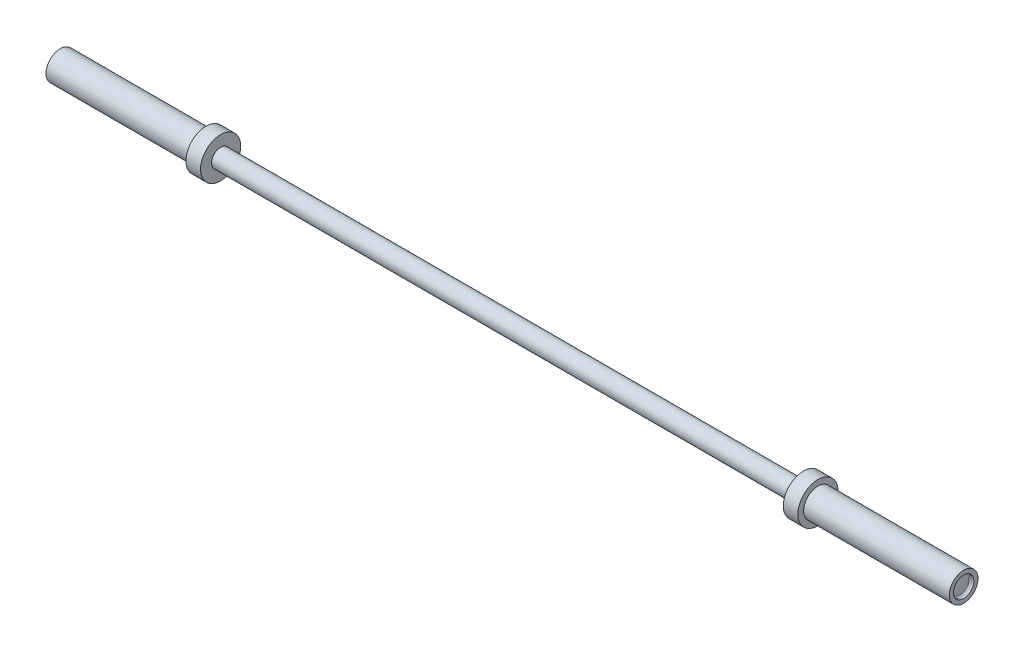
ISO-10303-21;
HEADER;
FILE_DESCRIPTION(('STEP AP214'),'2;1');
FILE_NAME('part.step','',(''),(''),'','','');
FILE_SCHEMA(('AUTOMOTIVE_DESIGN { 1 0 10303 214 1 1 1 1 }'));
ENDSEC;
DATA;
#1=APPLICATION_CONTEXT('core data for automotive mechanical design processes');
#2=APPLICATION_PROTOCOL_DEFINITION('international standard','automotive_design',2000,#1);
#3=PRODUCT_CONTEXT('',#1,'mechanical');
#4=PRODUCT('Part','Part','',(#3));
#5=PRODUCT_RELATED_PRODUCT_CATEGORY('part','',(#4));
#6=PRODUCT_DEFINITION_FORMATION('','',#4);
#7=PRODUCT_DEFINITION_CONTEXT('part definition',#1,'design');
#8=PRODUCT_DEFINITION('design','',#6,#7);
#9=PRODUCT_DEFINITION_SHAPE('','',#8);
#10=(LENGTH_UNIT() NAMED_UNIT(*) SI_UNIT(.MILLI.,.METRE.));
#11=(NAMED_UNIT(*) PLANE_ANGLE_UNIT() SI_UNIT($,.RADIAN.));
#12=(NAMED_UNIT(*) SI_UNIT($,.STERADIAN.) SOLID_ANGLE_UNIT());
#13=UNCERTAINTY_MEASURE_WITH_UNIT(LENGTH_MEASURE(1.E-05),#10,'distance_accuracy_value','');
#14=(GEOMETRIC_REPRESENTATION_CONTEXT(3) GLOBAL_UNCERTAINTY_ASSIGNED_CONTEXT((#13)) GLOBAL_UNIT_ASSIGNED_CONTEXT((#10,
#11,#12)) REPRESENTATION_CONTEXT('',''));
#15=CARTESIAN_POINT('',(0.,0.,0.));
#16=DIRECTION('',(0.,0.,1.));
#17=DIRECTION('',(1.,0.,0.));
#18=AXIS2_PLACEMENT_3D('',#15,#16,#17);
#19=CARTESIAN_POINT('',(1016.,0.,0.));
#20=DIRECTION('',(-1.,0.,0.));
#21=DIRECTION('',(0.,0.,1.));
#22=AXIS2_PLACEMENT_3D('',#19,#20,#21);
#23=CYLINDRICAL_SURFACE('',#22,15.875);
#24=CARTESIAN_POINT('',(1016.,0.,0.));
#25=DIRECTION('',(1.,0.,0.));
#26=DIRECTION('',(0.,0.,-1.));
#27=AXIS2_PLACEMENT_3D('',#24,#25,#26);
#28=CIRCLE('',#27,15.875);
#29=CARTESIAN_POINT('',(1016.,0.,-15.875));
#30=VERTEX_POINT('',#29);
#31=EDGE_CURVE('E58',#30,#30,#28,.T.);
#32=ORIENTED_EDGE('',*,*,#31,.F.);
#33=EDGE_LOOP('',(#32));
#34=FACE_BOUND('',#33,.T.);
#35=CARTESIAN_POINT('',(0.,0.,0.));
#36=DIRECTION('',(1.,0.,0.));
#37=DIRECTION('',(0.,0.,-1.));
#38=AXIS2_PLACEMENT_3D('',#35,#36,#37);
#39=CIRCLE('',#38,15.875);
#40=CARTESIAN_POINT('',(0.,0.,-15.875));
#41=VERTEX_POINT('',#40);
#42=EDGE_CURVE('E53',#41,#41,#39,.T.);
#43=ORIENTED_EDGE('',*,*,#42,.T.);
#44=EDGE_LOOP('',(#43));
#45=FACE_BOUND('',#44,.T.);
#46=ADVANCED_FACE('F32',(#34,#45),#23,.T.);
#47=CARTESIAN_POINT('',(1041.4,0.,0.));
#48=DIRECTION('',(-1.,0.,0.));
#49=DIRECTION('',(0.,0.,1.));
#50=AXIS2_PLACEMENT_3D('',#47,#48,#49);
#51=CYLINDRICAL_SURFACE('',#50,34.999999977);
#52=CARTESIAN_POINT('',(1041.4,0.,0.));
#53=DIRECTION('',(1.,0.,0.));
#54=DIRECTION('',(0.,0.,-1.));
#55=AXIS2_PLACEMENT_3D('',#52,#53,#54);
#56=CIRCLE('',#55,34.999999977);
#57=CARTESIAN_POINT('',(1041.4,0.,-34.999999977));
#58=VERTEX_POINT('',#57);
#59=EDGE_CURVE('E62',#58,#58,#56,.T.);
#60=ORIENTED_EDGE('',*,*,#59,.F.);
#61=EDGE_LOOP('',(#60));
#62=FACE_BOUND('',#61,.T.);
#63=CARTESIAN_POINT('',(1016.,0.,0.));
#64=DIRECTION('',(1.,0.,0.));
#65=DIRECTION('',(0.,0.,-1.));
#66=AXIS2_PLACEMENT_3D('',#63,#64,#65);
#67=CIRCLE('',#66,34.999999977);
#68=CARTESIAN_POINT('',(1016.,0.,-34.999999977));
#69=VERTEX_POINT('',#68);
#70=EDGE_CURVE('E56',#69,#69,#67,.T.);
#71=ORIENTED_EDGE('',*,*,#70,.T.);
#72=EDGE_LOOP('',(#71));
#73=FACE_BOUND('',#72,.T.);
#74=ADVANCED_FACE('F109',(#62,#73),#51,.T.);
#75=CARTESIAN_POINT('',(1041.4,0.,0.));
#76=DIRECTION('',(1.,0.,0.));
#77=DIRECTION('',(0.,0.,-1.));
#78=AXIS2_PLACEMENT_3D('',#75,#76,#77);
#79=PLANE('',#78);
#80=CARTESIAN_POINT('',(1041.4,0.,0.));
#81=DIRECTION('',(1.,0.,0.));
#82=DIRECTION('',(0.,0.,-1.));
#83=AXIS2_PLACEMENT_3D('',#80,#81,#82);
#84=CIRCLE('',#83,25.);
#85=CARTESIAN_POINT('',(1041.4,0.,-25.));
#86=VERTEX_POINT('',#85);
#87=EDGE_CURVE('E61',#86,#86,#84,.T.);
#88=ORIENTED_EDGE('',*,*,#87,.F.);
#89=EDGE_LOOP('',(#88));
#90=FACE_BOUND('',#89,.T.);
#91=ORIENTED_EDGE('',*,*,#59,.T.);
#92=EDGE_LOOP('',(#91));
#93=FACE_BOUND('',#92,.T.);
#94=ADVANCED_FACE('F105',(#90,#93),#79,.T.);
#95=CARTESIAN_POINT('',(1016.,0.,0.));
#96=DIRECTION('',(1.,0.,0.));
#97=DIRECTION('',(0.,0.,-1.));
#98=AXIS2_PLACEMENT_3D('',#95,#96,#97);
#99=PLANE('',#98);
#100=ORIENTED_EDGE('',*,*,#31,.T.);
#101=EDGE_LOOP('',(#100));
#102=FACE_BOUND('',#101,.T.);
#103=ORIENTED_EDGE('',*,*,#70,.F.);
#104=EDGE_LOOP('',(#103));
#105=FACE_BOUND('',#104,.T.);
#106=ADVANCED_FACE('F108',(#102,#105),#99,.F.);
#107=CARTESIAN_POINT('',(-25.4,0.,0.));
#108=DIRECTION('',(1.,0.,0.));
#109=DIRECTION('',(0.,0.,-1.));
#110=AXIS2_PLACEMENT_3D('',#107,#108,#109);
#111=CYLINDRICAL_SURFACE('',#110,34.999999977);
#112=CARTESIAN_POINT('',(-25.4,0.,0.));
#113=DIRECTION('',(-1.,0.,0.));
#114=DIRECTION('',(0.,0.,1.));
#115=AXIS2_PLACEMENT_3D('',#112,#113,#114);
#116=CIRCLE('',#115,34.999999977);
#117=CARTESIAN_POINT('',(-25.4,0.,34.999999977));
#118=VERTEX_POINT('',#117);
#119=EDGE_CURVE('E57',#118,#118,#116,.T.);
#120=ORIENTED_EDGE('',*,*,#119,.F.);
#121=EDGE_LOOP('',(#120));
#122=FACE_BOUND('',#121,.T.);
#123=CARTESIAN_POINT('',(0.,0.,0.));
#124=DIRECTION('',(-1.,0.,0.));
#125=DIRECTION('',(0.,0.,1.));
#126=AXIS2_PLACEMENT_3D('',#123,#124,#125);
#127=CIRCLE('',#126,34.999999977);
#128=CARTESIAN_POINT('',(0.,0.,34.999999977));
#129=VERTEX_POINT('',#128);
#130=EDGE_CURVE('E67',#129,#129,#127,.T.);
#131=ORIENTED_EDGE('',*,*,#130,.T.);
#132=EDGE_LOOP('',(#131));
#133=FACE_BOUND('',#132,.T.);
#134=ADVANCED_FACE('F119',(#122,#133),#111,.T.);
#135=CARTESIAN_POINT('',(-25.4,0.,0.));
#136=DIRECTION('',(-1.,0.,0.));
#137=DIRECTION('',(0.,0.,1.));
#138=AXIS2_PLACEMENT_3D('',#135,#136,#137);
#139=PLANE('',#138);
#140=CARTESIAN_POINT('',(-25.4,0.,0.));
#141=DIRECTION('',(-1.,0.,0.));
#142=DIRECTION('',(0.,0.,1.));
#143=AXIS2_PLACEMENT_3D('',#140,#141,#142);
#144=CIRCLE('',#143,25.);
#145=CARTESIAN_POINT('',(-25.4,0.,25.));
#146=VERTEX_POINT('',#145);
#147=EDGE_CURVE('E52',#146,#146,#144,.T.);
#148=ORIENTED_EDGE('',*,*,#147,.F.);
#149=EDGE_LOOP('',(#148));
#150=FACE_BOUND('',#149,.T.);
#151=ORIENTED_EDGE('',*,*,#119,.T.);
#152=EDGE_LOOP('',(#151));
#153=FACE_BOUND('',#152,.T.);
#154=ADVANCED_FACE('F125',(#150,#153),#139,.T.);
#155=CARTESIAN_POINT('',(0.,0.,0.));
#156=DIRECTION('',(-1.,0.,0.));
#157=DIRECTION('',(0.,0.,1.));
#158=AXIS2_PLACEMENT_3D('',#155,#156,#157);
#159=PLANE('',#158);
#160=ORIENTED_EDGE('',*,*,#42,.F.);
#161=EDGE_LOOP('',(#160));
#162=FACE_BOUND('',#161,.T.);
#163=ORIENTED_EDGE('',*,*,#130,.F.);
#164=EDGE_LOOP('',(#163));
#165=FACE_BOUND('',#164,.T.);
#166=ADVANCED_FACE('F101',(#162,#165),#159,.F.);
#167=CARTESIAN_POINT('',(1295.4,0.,0.));
#168=DIRECTION('',(-1.,0.,0.));
#169=DIRECTION('',(0.,0.,1.));
#170=AXIS2_PLACEMENT_3D('',#167,#168,#169);
#171=CYLINDRICAL_SURFACE('',#170,25.);
#172=CARTESIAN_POINT('',(1295.4,0.,0.));
#173=DIRECTION('',(1.,0.,0.));
#174=DIRECTION('',(0.,0.,-1.));
#175=AXIS2_PLACEMENT_3D('',#172,#173,#174);
#176=CIRCLE('',#175,25.);
#177=CARTESIAN_POINT('',(1295.4,0.,-25.));
#178=VERTEX_POINT('',#177);
#179=EDGE_CURVE('E70',#178,#178,#176,.T.);
#180=ORIENTED_EDGE('',*,*,#179,.F.);
#181=EDGE_LOOP('',(#180));
#182=FACE_BOUND('',#181,.T.);
#183=ORIENTED_EDGE('',*,*,#87,.T.);
#184=EDGE_LOOP('',(#183));
#185=FACE_BOUND('',#184,.T.);
#186=ADVANCED_FACE('F95',(#182,#185),#171,.T.);
#187=CARTESIAN_POINT('',(1295.4,0.,0.));
#188=DIRECTION('',(1.,0.,0.));
#189=DIRECTION('',(0.,0.,-1.));
#190=AXIS2_PLACEMENT_3D('',#187,#188,#189);
#191=PLANE('',#190);
#192=CARTESIAN_POINT('',(1295.4,0.,0.));
#193=DIRECTION('',(1.,0.,0.));
#194=DIRECTION('',(0.,0.,-1.));
#195=AXIS2_PLACEMENT_3D('',#192,#193,#194);
#196=CIRCLE('',#195,17.78);
#197=CARTESIAN_POINT('',(1295.4,0.,-17.78));
#198=VERTEX_POINT('',#197);
#199=EDGE_CURVE('E85',#198,#198,#196,.T.);
#200=ORIENTED_EDGE('',*,*,#199,.F.);
#201=EDGE_LOOP('',(#200));
#202=FACE_BOUND('',#201,.T.);
#203=ORIENTED_EDGE('',*,*,#179,.T.);
#204=EDGE_LOOP('',(#203));
#205=FACE_BOUND('',#204,.T.);
#206=ADVANCED_FACE('F91',(#202,#205),#191,.T.);
#207=CARTESIAN_POINT('',(-279.4,0.,0.));
#208=DIRECTION('',(1.,0.,0.));
#209=DIRECTION('',(0.,0.,-1.));
#210=AXIS2_PLACEMENT_3D('',#207,#208,#209);
#211=CYLINDRICAL_SURFACE('',#210,25.);
#212=CARTESIAN_POINT('',(-279.4,0.,0.));
#213=DIRECTION('',(-1.,0.,0.));
#214=DIRECTION('',(0.,0.,1.));
#215=AXIS2_PLACEMENT_3D('',#212,#213,#214);
#216=CIRCLE('',#215,25.);
#217=CARTESIAN_POINT('',(-279.4,0.,25.));
#218=VERTEX_POINT('',#217);
#219=EDGE_CURVE('E77',#218,#218,#216,.T.);
#220=ORIENTED_EDGE('',*,*,#219,.F.);
#221=EDGE_LOOP('',(#220));
#222=FACE_BOUND('',#221,.T.);
#223=ORIENTED_EDGE('',*,*,#147,.T.);
#224=EDGE_LOOP('',(#223));
#225=FACE_BOUND('',#224,.T.);
#226=ADVANCED_FACE('F94',(#222,#225),#211,.T.);
#227=CARTESIAN_POINT('',(-279.4,0.,0.));
#228=DIRECTION('',(-1.,0.,0.));
#229=DIRECTION('',(0.,0.,1.));
#230=AXIS2_PLACEMENT_3D('',#227,#228,#229);
#231=PLANE('',#230);
#232=CARTESIAN_POINT('',(-279.4,0.,0.));
#233=DIRECTION('',(-1.,0.,0.));
#234=DIRECTION('',(0.,0.,1.));
#235=AXIS2_PLACEMENT_3D('',#232,#233,#234);
#236=CIRCLE('',#235,17.78);
#237=CARTESIAN_POINT('',(-279.4,0.,17.78));
#238=VERTEX_POINT('',#237);
#239=EDGE_CURVE('E82',#238,#238,#236,.T.);
#240=ORIENTED_EDGE('',*,*,#239,.F.);
#241=EDGE_LOOP('',(#240));
#242=FACE_BOUND('',#241,.T.);
#243=ORIENTED_EDGE('',*,*,#219,.T.);
#244=EDGE_LOOP('',(#243));
#245=FACE_BOUND('',#244,.T.);
#246=ADVANCED_FACE('F161',(#242,#245),#231,.T.);
#247=CARTESIAN_POINT('',(-273.05,0.,0.));
#248=DIRECTION('',(-1.,0.,0.));
#249=DIRECTION('',(0.,0.,1.));
#250=AXIS2_PLACEMENT_3D('',#247,#248,#249);
#251=CYLINDRICAL_SURFACE('',#250,17.78);
#252=CARTESIAN_POINT('',(-275.59,0.,0.));
#253=DIRECTION('',(-1.,0.,0.));
#254=DIRECTION('',(0.,0.,1.));
#255=AXIS2_PLACEMENT_3D('',#252,#253,#254);
#256=CIRCLE('',#255,17.78);
#257=CARTESIAN_POINT('',(-275.59,0.,17.78));
#258=VERTEX_POINT('',#257);
#259=EDGE_CURVE('E10',#258,#258,#256,.F.);
#260=ORIENTED_EDGE('',*,*,#259,.T.);
#261=EDGE_LOOP('',(#260));
#262=FACE_BOUND('',#261,.T.);
#263=ORIENTED_EDGE('',*,*,#239,.T.);
#264=EDGE_LOOP('',(#263));
#265=FACE_BOUND('',#264,.T.);
#266=ADVANCED_FACE('F156',(#262,#265),#251,.F.);
#267=CARTESIAN_POINT('',(-273.05,0.,0.));
#268=DIRECTION('',(-1.,0.,0.));
#269=DIRECTION('',(0.,0.,1.));
#270=AXIS2_PLACEMENT_3D('',#267,#268,#269);
#271=PLANE('',#270);
#272=CARTESIAN_POINT('',(-273.05,0.,0.));
#273=DIRECTION('',(-1.,0.,0.));
#274=DIRECTION('',(0.,0.,1.));
#275=AXIS2_PLACEMENT_3D('',#272,#273,#274);
#276=CIRCLE('',#275,15.24);
#277=CARTESIAN_POINT('',(-273.05,0.,15.24));
#278=VERTEX_POINT('',#277);
#279=EDGE_CURVE('E39',#278,#278,#276,.T.);
#280=ORIENTED_EDGE('',*,*,#279,.T.);
#281=EDGE_LOOP('',(#280));
#282=FACE_BOUND('',#281,.T.);
#283=ADVANCED_FACE('F151',(#282),#271,.T.);
#284=CARTESIAN_POINT('',(1289.05,0.,0.));
#285=DIRECTION('',(1.,0.,0.));
#286=DIRECTION('',(0.,0.,-1.));
#287=AXIS2_PLACEMENT_3D('',#284,#285,#286);
#288=CYLINDRICAL_SURFACE('',#287,17.78);
#289=CARTESIAN_POINT('',(1291.59,0.,0.));
#290=DIRECTION('',(1.,0.,0.));
#291=DIRECTION('',(0.,0.,-1.));
#292=AXIS2_PLACEMENT_3D('',#289,#290,#291);
#293=CIRCLE('',#292,17.78);
#294=CARTESIAN_POINT('',(1291.59,0.,-17.78));
#295=VERTEX_POINT('',#294);
#296=EDGE_CURVE('E43',#295,#295,#293,.F.);
#297=ORIENTED_EDGE('',*,*,#296,.T.);
#298=EDGE_LOOP('',(#297));
#299=FACE_BOUND('',#298,.T.);
#300=ORIENTED_EDGE('',*,*,#199,.T.);
#301=EDGE_LOOP('',(#300));
#302=FACE_BOUND('',#301,.T.);
#303=ADVANCED_FACE('F89',(#299,#302),#288,.F.);
#304=CARTESIAN_POINT('',(1289.05,0.,0.));
#305=DIRECTION('',(1.,0.,0.));
#306=DIRECTION('',(0.,0.,-1.));
#307=AXIS2_PLACEMENT_3D('',#304,#305,#306);
#308=PLANE('',#307);
#309=CARTESIAN_POINT('',(1289.05,0.,0.));
#310=DIRECTION('',(1.,0.,0.));
#311=DIRECTION('',(0.,0.,-1.));
#312=AXIS2_PLACEMENT_3D('',#309,#310,#311);
#313=CIRCLE('',#312,15.24);
#314=CARTESIAN_POINT('',(1289.05,0.,-15.24));
#315=VERTEX_POINT('',#314);
#316=EDGE_CURVE('E47',#315,#315,#313,.T.);
#317=ORIENTED_EDGE('',*,*,#316,.T.);
#318=EDGE_LOOP('',(#317));
#319=FACE_BOUND('',#318,.T.);
#320=ADVANCED_FACE('F137',(#319),#308,.T.);
#321=CARTESIAN_POINT('',(1291.59,0.,0.));
#322=DIRECTION('',(1.,0.,0.));
#323=DIRECTION('',(0.,0.,-1.));
#324=AXIS2_PLACEMENT_3D('',#321,#322,#323);
#325=TOROIDAL_SURFACE('',#324,15.24,2.54);
#326=ORIENTED_EDGE('',*,*,#296,.F.);
#327=EDGE_LOOP('',(#326));
#328=FACE_BOUND('',#327,.T.);
#329=ORIENTED_EDGE('',*,*,#316,.F.);
#330=EDGE_LOOP('',(#329));
#331=FACE_BOUND('',#330,.T.);
#332=ADVANCED_FACE('F135',(#328,#331),#325,.F.);
#333=CARTESIAN_POINT('',(-275.59,0.,0.));
#334=DIRECTION('',(-1.,0.,0.));
#335=DIRECTION('',(0.,0.,1.));
#336=AXIS2_PLACEMENT_3D('',#333,#334,#335);
#337=TOROIDAL_SURFACE('',#336,15.24,2.54);
#338=ORIENTED_EDGE('',*,*,#259,.F.);
#339=EDGE_LOOP('',(#338));
#340=FACE_BOUND('',#339,.T.);
#341=ORIENTED_EDGE('',*,*,#279,.F.);
#342=EDGE_LOOP('',(#341));
#343=FACE_BOUND('',#342,.T.);
#344=ADVANCED_FACE('F34',(#340,#343),#337,.F.);
#345=CLOSED_SHELL('',(#46,#74,#94,#106,#134,#154,#166,#186,#206,#226,#246,#266,#283,#303,#320,
#332,#344));
#346=MANIFOLD_SOLID_BREP('B2',#345);
#347=ADVANCED_BREP_SHAPE_REPRESENTATION('',(#18,#346),#14);
#348=SHAPE_DEFINITION_REPRESENTATION(#9,#347);
ENDSEC;
END-ISO-10303-21;
